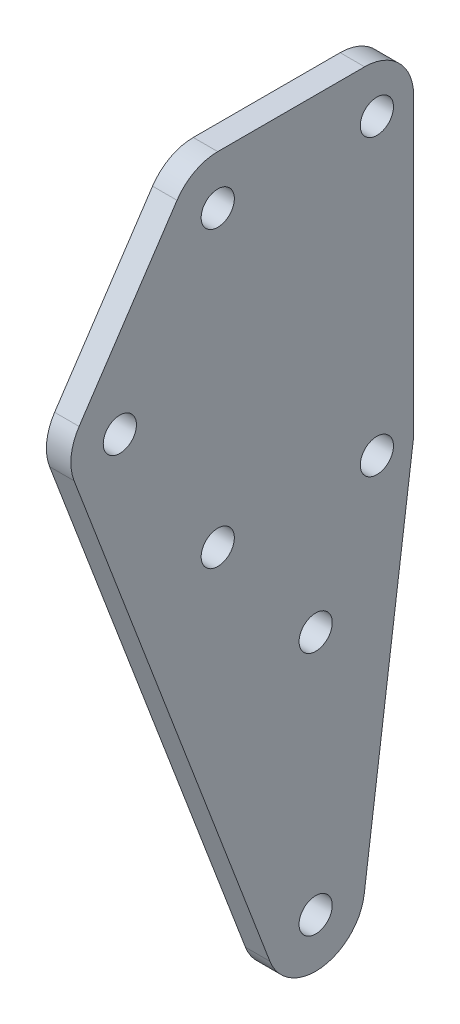
ISO-10303-21;
HEADER;
FILE_DESCRIPTION(('STEP AP214'),'2;1');
FILE_NAME('part.step','',(''),(''),'','','');
FILE_SCHEMA(('AUTOMOTIVE_DESIGN { 1 0 10303 214 1 1 1 1 }'));
ENDSEC;
DATA;
#1=APPLICATION_CONTEXT('core data for automotive mechanical design processes');
#2=APPLICATION_PROTOCOL_DEFINITION('international standard','automotive_design',2000,#1);
#3=PRODUCT_CONTEXT('',#1,'mechanical');
#4=PRODUCT('Part','Part','',(#3));
#5=PRODUCT_RELATED_PRODUCT_CATEGORY('part','',(#4));
#6=PRODUCT_DEFINITION_FORMATION('','',#4);
#7=PRODUCT_DEFINITION_CONTEXT('part definition',#1,'design');
#8=PRODUCT_DEFINITION('design','',#6,#7);
#9=PRODUCT_DEFINITION_SHAPE('','',#8);
#10=(LENGTH_UNIT() NAMED_UNIT(*) SI_UNIT(.MILLI.,.METRE.));
#11=(NAMED_UNIT(*) PLANE_ANGLE_UNIT() SI_UNIT($,.RADIAN.));
#12=(NAMED_UNIT(*) SI_UNIT($,.STERADIAN.) SOLID_ANGLE_UNIT());
#13=UNCERTAINTY_MEASURE_WITH_UNIT(LENGTH_MEASURE(1.E-05),#10,'distance_accuracy_value','');
#14=(GEOMETRIC_REPRESENTATION_CONTEXT(3) GLOBAL_UNCERTAINTY_ASSIGNED_CONTEXT((#13)) GLOBAL_UNIT_ASSIGNED_CONTEXT((#10,
#11,#12)) REPRESENTATION_CONTEXT('',''));
#15=CARTESIAN_POINT('',(0.,0.,0.));
#16=DIRECTION('',(0.,0.,1.));
#17=DIRECTION('',(1.,0.,0.));
#18=AXIS2_PLACEMENT_3D('',#15,#16,#17);
#19=CARTESIAN_POINT('',(1.5875,-50.8,-25.4));
#20=DIRECTION('',(0.,0.,1.));
#21=DIRECTION('',(1.,0.,0.));
#22=AXIS2_PLACEMENT_3D('',#19,#20,#21);
#23=PLANE('',#22);
#24=DIRECTION('',(-1.,0.,0.));
#25=VECTOR('',#24,1.);
#26=CARTESIAN_POINT('',(1.5875,44.4499999999997,-25.4));
#27=LINE('',#26,#25);
#28=CARTESIAN_POINT('',(1.5875,44.4499999999997,-25.4));
#29=VERTEX_POINT('',#28);
#30=CARTESIAN_POINT('',(-1.5875,44.4499999999997,-25.4));
#31=VERTEX_POINT('',#30);
#32=EDGE_CURVE('E57',#29,#31,#27,.T.);
#33=ORIENTED_EDGE('',*,*,#32,.F.);
#34=DIRECTION('',(0.,1.,0.));
#35=VECTOR('',#34,1.);
#36=CARTESIAN_POINT('',(1.5875,-50.8,-25.4));
#37=LINE('',#36,#35);
#38=CARTESIAN_POINT('',(1.5875,6.3499999999998,-25.4));
#39=VERTEX_POINT('',#38);
#40=EDGE_CURVE('E41',#39,#29,#37,.T.);
#41=ORIENTED_EDGE('',*,*,#40,.F.);
#42=DIRECTION('',(-1.,0.,0.));
#43=VECTOR('',#42,1.);
#44=CARTESIAN_POINT('',(1.5875,6.3499999999998,-25.4));
#45=LINE('',#44,#43);
#46=CARTESIAN_POINT('',(-1.5875,6.3499999999998,-25.4));
#47=VERTEX_POINT('',#46);
#48=EDGE_CURVE('E125',#39,#47,#45,.T.);
#49=ORIENTED_EDGE('',*,*,#48,.T.);
#50=DIRECTION('',(0.,1.,0.));
#51=VECTOR('',#50,1.);
#52=CARTESIAN_POINT('',(-1.5875,-50.8,-25.4));
#53=LINE('',#52,#51);
#54=EDGE_CURVE('E124',#47,#31,#53,.T.);
#55=ORIENTED_EDGE('',*,*,#54,.T.);
#56=EDGE_LOOP('',(#33,#41,#49,#55));
#57=FACE_BOUND('',#56,.T.);
#58=ADVANCED_FACE('F33',(#57),#23,.F.);
#59=CARTESIAN_POINT('',(1.5875,50.8,25.4));
#60=DIRECTION('',(0.,-1.,0.));
#61=DIRECTION('',(0.,0.,-1.));
#62=AXIS2_PLACEMENT_3D('',#59,#60,#61);
#63=PLANE('',#62);
#64=DIRECTION('',(0.,0.,1.));
#65=VECTOR('',#64,1.);
#66=CARTESIAN_POINT('',(1.5875,50.8,25.4));
#67=LINE('',#66,#65);
#68=CARTESIAN_POINT('',(1.5875,50.8,-19.0499999999997));
#69=VERTEX_POINT('',#68);
#70=CARTESIAN_POINT('',(1.5875,50.8,0.));
#71=VERTEX_POINT('',#70);
#72=EDGE_CURVE('E11',#69,#71,#67,.T.);
#73=ORIENTED_EDGE('',*,*,#72,.F.);
#74=DIRECTION('',(-1.,0.,0.));
#75=VECTOR('',#74,1.);
#76=CARTESIAN_POINT('',(1.5875,50.8,-19.0499999999997));
#77=LINE('',#76,#75);
#78=CARTESIAN_POINT('',(-1.5875,50.8,-19.0499999999997));
#79=VERTEX_POINT('',#78);
#80=EDGE_CURVE('E112',#69,#79,#77,.T.);
#81=ORIENTED_EDGE('',*,*,#80,.T.);
#82=DIRECTION('',(0.,0.,1.));
#83=VECTOR('',#82,1.);
#84=CARTESIAN_POINT('',(-1.5875,50.8,25.4));
#85=LINE('',#84,#83);
#86=CARTESIAN_POINT('',(-1.5875,50.8,0.));
#87=VERTEX_POINT('',#86);
#88=EDGE_CURVE('E36',#79,#87,#85,.T.);
#89=ORIENTED_EDGE('',*,*,#88,.T.);
#90=DIRECTION('',(-1.,0.,0.));
#91=VECTOR('',#90,1.);
#92=CARTESIAN_POINT('',(1.5875,50.8,0.));
#93=LINE('',#92,#91);
#94=EDGE_CURVE('E194',#71,#87,#93,.T.);
#95=ORIENTED_EDGE('',*,*,#94,.F.);
#96=EDGE_LOOP('',(#73,#81,#89,#95));
#97=FACE_BOUND('',#96,.T.);
#98=ADVANCED_FACE('F246',(#97),#63,.F.);
#99=CARTESIAN_POINT('',(1.5875,0.,0.));
#100=DIRECTION('',(-1.,0.,0.));
#101=DIRECTION('',(0.,0.,1.));
#102=AXIS2_PLACEMENT_3D('',#99,#100,#101);
#103=PLANE('',#102);
#104=CARTESIAN_POINT('',(1.5875,-41.2750000000002,-12.7));
#105=DIRECTION('',(-1.,0.,0.));
#106=DIRECTION('',(0.,0.,1.));
#107=AXIS2_PLACEMENT_3D('',#104,#105,#106);
#108=CIRCLE('',#107,2.15265);
#109=CARTESIAN_POINT('',(1.5875,-41.2750000000002,-10.54735));
#110=VERTEX_POINT('',#109);
#111=EDGE_CURVE('E175',#110,#110,#108,.T.);
#112=ORIENTED_EDGE('',*,*,#111,.T.);
#113=EDGE_LOOP('',(#112));
#114=FACE_BOUND('',#113,.T.);
#115=CARTESIAN_POINT('',(1.5875,-9.52500000000017,-12.7));
#116=DIRECTION('',(-1.,0.,0.));
#117=DIRECTION('',(0.,0.,1.));
#118=AXIS2_PLACEMENT_3D('',#115,#116,#117);
#119=CIRCLE('',#118,2.15265);
#120=CARTESIAN_POINT('',(1.5875,-9.52500000000017,-10.54735));
#121=VERTEX_POINT('',#120);
#122=EDGE_CURVE('E169',#121,#121,#119,.T.);
#123=ORIENTED_EDGE('',*,*,#122,.T.);
#124=EDGE_LOOP('',(#123));
#125=FACE_BOUND('',#124,.T.);
#126=CARTESIAN_POINT('',(1.5875,6.3499999999998,-20.6375));
#127=DIRECTION('',(-1.,0.,0.));
#128=DIRECTION('',(0.,0.,1.));
#129=AXIS2_PLACEMENT_3D('',#126,#127,#128);
#130=CIRCLE('',#129,2.15265);
#131=CARTESIAN_POINT('',(1.5875,6.3499999999998,-18.48485));
#132=VERTEX_POINT('',#131);
#133=EDGE_CURVE('E163',#132,#132,#130,.T.);
#134=ORIENTED_EDGE('',*,*,#133,.T.);
#135=EDGE_LOOP('',(#134));
#136=FACE_BOUND('',#135,.T.);
#137=CARTESIAN_POINT('',(1.5875,6.34999999999968,0.));
#138=DIRECTION('',(-1.,0.,0.));
#139=DIRECTION('',(0.,0.,1.));
#140=AXIS2_PLACEMENT_3D('',#137,#138,#139);
#141=CIRCLE('',#140,2.15265);
#142=CARTESIAN_POINT('',(1.5875,6.34999999999968,2.15265000000005));
#143=VERTEX_POINT('',#142);
#144=EDGE_CURVE('E157',#143,#143,#141,.T.);
#145=ORIENTED_EDGE('',*,*,#144,.T.);
#146=EDGE_LOOP('',(#145));
#147=FACE_BOUND('',#146,.T.);
#148=CARTESIAN_POINT('',(1.5875,25.3999999999997,12.7000000000001));
#149=DIRECTION('',(-1.,0.,0.));
#150=DIRECTION('',(0.,0.,1.));
#151=AXIS2_PLACEMENT_3D('',#148,#149,#150);
#152=CIRCLE('',#151,2.15265);
#153=CARTESIAN_POINT('',(1.5875,25.3999999999997,14.8526500000001));
#154=VERTEX_POINT('',#153);
#155=EDGE_CURVE('E151',#154,#154,#152,.T.);
#156=ORIENTED_EDGE('',*,*,#155,.T.);
#157=EDGE_LOOP('',(#156));
#158=FACE_BOUND('',#157,.T.);
#159=CARTESIAN_POINT('',(1.5875,44.4499999999997,0.));
#160=DIRECTION('',(-1.,0.,0.));
#161=DIRECTION('',(0.,0.,1.));
#162=AXIS2_PLACEMENT_3D('',#159,#160,#161);
#163=CIRCLE('',#162,2.15265);
#164=CARTESIAN_POINT('',(1.5875,44.4499999999997,2.15265000000005));
#165=VERTEX_POINT('',#164);
#166=EDGE_CURVE('E142',#165,#165,#163,.T.);
#167=ORIENTED_EDGE('',*,*,#166,.T.);
#168=EDGE_LOOP('',(#167));
#169=FACE_BOUND('',#168,.T.);
#170=CARTESIAN_POINT('',(1.5875,44.4499999999998,-20.6375));
#171=DIRECTION('',(-1.,0.,0.));
#172=DIRECTION('',(0.,0.,1.));
#173=AXIS2_PLACEMENT_3D('',#170,#171,#172);
#174=CIRCLE('',#173,2.15265);
#175=CARTESIAN_POINT('',(1.5875,44.4499999999998,-18.48485));
#176=VERTEX_POINT('',#175);
#177=EDGE_CURVE('E135',#176,#176,#174,.T.);
#178=ORIENTED_EDGE('',*,*,#177,.T.);
#179=EDGE_LOOP('',(#178));
#180=FACE_BOUND('',#179,.T.);
#181=CARTESIAN_POINT('',(1.5875,44.4499999999997,-19.0499999999997));
#182=DIRECTION('',(-1.,0.,0.));
#183=DIRECTION('',(0.,0.,1.));
#184=AXIS2_PLACEMENT_3D('',#181,#182,#183);
#185=CIRCLE('',#184,6.35000000000031);
#186=EDGE_CURVE('E109',#69,#29,#185,.T.);
#187=ORIENTED_EDGE('',*,*,#186,.F.);
#188=ORIENTED_EDGE('',*,*,#72,.T.);
#189=CARTESIAN_POINT('',(1.5875,44.4499999999997,0.));
#190=DIRECTION('',(-1.,0.,0.));
#191=DIRECTION('',(0.,0.,-1.));
#192=AXIS2_PLACEMENT_3D('',#189,#190,#191);
#193=CIRCLE('',#192,6.35000000000032);
#194=CARTESIAN_POINT('',(1.5875,47.97234624603,5.28351936904567));
#195=VERTEX_POINT('',#194);
#196=EDGE_CURVE('E126',#195,#71,#193,.T.);
#197=ORIENTED_EDGE('',*,*,#196,.F.);
#198=DIRECTION('',(0.,0.832050294337851,-0.554700196225218));
#199=VECTOR('',#198,1.);
#200=CARTESIAN_POINT('',(1.5875,47.97234624603,5.28351936904567));
#201=LINE('',#200,#199);
#202=CARTESIAN_POINT('',(1.5875,28.9223462460298,17.9835193690454));
#203=VERTEX_POINT('',#202);
#204=EDGE_CURVE('E218',#203,#195,#201,.T.);
#205=ORIENTED_EDGE('',*,*,#204,.F.);
#206=CARTESIAN_POINT('',(1.5875,25.3999999999997,12.7000000000001));
#207=DIRECTION('',(-1.,0.,0.));
#208=DIRECTION('',(0.,0.,-1.));
#209=AXIS2_PLACEMENT_3D('',#206,#207,#208);
#210=CIRCLE('',#209,6.35);
#211=CARTESIAN_POINT('',(1.5875,23.1394296697906,18.633997116799));
#212=VERTEX_POINT('',#211);
#213=EDGE_CURVE('E221',#212,#203,#210,.T.);
#214=ORIENTED_EDGE('',*,*,#213,.F.);
#215=DIRECTION('',(0.,0.934487734928968,0.355995327591989));
#216=VECTOR('',#215,1.);
#217=CARTESIAN_POINT('',(1.5875,-43.5355703302093,-6.76600288320103));
#218=LINE('',#217,#216);
#219=CARTESIAN_POINT('',(1.5875,-43.5355703302093,-6.76600288320103));
#220=VERTEX_POINT('',#219);
#221=EDGE_CURVE('E224',#220,#212,#218,.T.);
#222=ORIENTED_EDGE('',*,*,#221,.F.);
#223=CARTESIAN_POINT('',(1.5875,-41.2750000000002,-12.7));
#224=DIRECTION('',(-1.,0.,0.));
#225=DIRECTION('',(0.,0.,1.));
#226=AXIS2_PLACEMENT_3D('',#223,#224,#225);
#227=CIRCLE('',#226,6.35);
#228=CARTESIAN_POINT('',(1.5875,-42.1124231824345,-18.9945390946058));
#229=VERTEX_POINT('',#228);
#230=EDGE_CURVE('E227',#229,#220,#227,.T.);
#231=ORIENTED_EDGE('',*,*,#230,.F.);
#232=DIRECTION('',(0.,-0.991265999150529,0.131877666525089));
#233=VECTOR('',#232,1.);
#234=CARTESIAN_POINT('',(1.5875,5.72193261317406,-25.3584043209544));
#235=LINE('',#234,#233);
#236=CARTESIAN_POINT('',(1.5875,5.72193261317406,-25.3584043209544));
#237=VERTEX_POINT('',#236);
#238=EDGE_CURVE('E230',#237,#229,#235,.T.);
#239=ORIENTED_EDGE('',*,*,#238,.F.);
#240=CARTESIAN_POINT('',(1.5875,6.3499999999998,-20.6375));
#241=DIRECTION('',(-1.,0.,0.));
#242=DIRECTION('',(0.,0.,1.));
#243=AXIS2_PLACEMENT_3D('',#240,#241,#242);
#244=CIRCLE('',#243,4.76250000000001);
#245=EDGE_CURVE('E116',#39,#237,#244,.T.);
#246=ORIENTED_EDGE('',*,*,#245,.F.);
#247=ORIENTED_EDGE('',*,*,#40,.T.);
#248=EDGE_LOOP('',(#187,#188,#197,#205,#214,#222,#231,#239,#246,#247));
#249=FACE_BOUND('',#248,.T.);
#250=ADVANCED_FACE('F129',(#114,#125,#136,#147,#158,#169,#180,#249),#103,.F.);
#251=CARTESIAN_POINT('',(-1.5875,0.,0.));
#252=DIRECTION('',(-1.,0.,0.));
#253=DIRECTION('',(0.,0.,1.));
#254=AXIS2_PLACEMENT_3D('',#251,#252,#253);
#255=PLANE('',#254);
#256=CARTESIAN_POINT('',(-1.5875,-41.2750000000002,-12.7));
#257=DIRECTION('',(-1.,0.,0.));
#258=DIRECTION('',(0.,0.,1.));
#259=AXIS2_PLACEMENT_3D('',#256,#257,#258);
#260=CIRCLE('',#259,2.15264999999999);
#261=CARTESIAN_POINT('',(-1.5875,-41.2750000000002,-10.54735));
#262=VERTEX_POINT('',#261);
#263=EDGE_CURVE('E178',#262,#262,#260,.T.);
#264=ORIENTED_EDGE('',*,*,#263,.F.);
#265=EDGE_LOOP('',(#264));
#266=FACE_BOUND('',#265,.T.);
#267=CARTESIAN_POINT('',(-1.5875,-9.52500000000017,-12.7));
#268=DIRECTION('',(-1.,0.,0.));
#269=DIRECTION('',(0.,0.,1.));
#270=AXIS2_PLACEMENT_3D('',#267,#268,#269);
#271=CIRCLE('',#270,2.15264999999999);
#272=CARTESIAN_POINT('',(-1.5875,-9.52500000000017,-10.54735));
#273=VERTEX_POINT('',#272);
#274=EDGE_CURVE('E172',#273,#273,#271,.T.);
#275=ORIENTED_EDGE('',*,*,#274,.F.);
#276=EDGE_LOOP('',(#275));
#277=FACE_BOUND('',#276,.T.);
#278=CARTESIAN_POINT('',(-1.5875,6.3499999999998,-20.6375));
#279=DIRECTION('',(-1.,0.,0.));
#280=DIRECTION('',(0.,0.,1.));
#281=AXIS2_PLACEMENT_3D('',#278,#279,#280);
#282=CIRCLE('',#281,2.15264999999999);
#283=CARTESIAN_POINT('',(-1.5875,6.3499999999998,-18.48485));
#284=VERTEX_POINT('',#283);
#285=EDGE_CURVE('E166',#284,#284,#282,.T.);
#286=ORIENTED_EDGE('',*,*,#285,.F.);
#287=EDGE_LOOP('',(#286));
#288=FACE_BOUND('',#287,.T.);
#289=CARTESIAN_POINT('',(-1.5875,6.34999999999968,0.));
#290=DIRECTION('',(-1.,0.,0.));
#291=DIRECTION('',(0.,0.,1.));
#292=AXIS2_PLACEMENT_3D('',#289,#290,#291);
#293=CIRCLE('',#292,2.15264999999999);
#294=CARTESIAN_POINT('',(-1.5875,6.34999999999968,2.15265000000004));
#295=VERTEX_POINT('',#294);
#296=EDGE_CURVE('E160',#295,#295,#293,.T.);
#297=ORIENTED_EDGE('',*,*,#296,.F.);
#298=EDGE_LOOP('',(#297));
#299=FACE_BOUND('',#298,.T.);
#300=CARTESIAN_POINT('',(-1.5875,25.3999999999997,12.7000000000001));
#301=DIRECTION('',(-1.,0.,0.));
#302=DIRECTION('',(0.,0.,1.));
#303=AXIS2_PLACEMENT_3D('',#300,#301,#302);
#304=CIRCLE('',#303,2.15264999999999);
#305=CARTESIAN_POINT('',(-1.5875,25.3999999999997,14.8526500000001));
#306=VERTEX_POINT('',#305);
#307=EDGE_CURVE('E154',#306,#306,#304,.T.);
#308=ORIENTED_EDGE('',*,*,#307,.F.);
#309=EDGE_LOOP('',(#308));
#310=FACE_BOUND('',#309,.T.);
#311=CARTESIAN_POINT('',(-1.5875,44.4499999999997,0.));
#312=DIRECTION('',(-1.,0.,0.));
#313=DIRECTION('',(0.,0.,1.));
#314=AXIS2_PLACEMENT_3D('',#311,#312,#313);
#315=CIRCLE('',#314,2.15264999999999);
#316=CARTESIAN_POINT('',(-1.5875,44.4499999999997,2.15265000000005));
#317=VERTEX_POINT('',#316);
#318=EDGE_CURVE('E146',#317,#317,#315,.T.);
#319=ORIENTED_EDGE('',*,*,#318,.F.);
#320=EDGE_LOOP('',(#319));
#321=FACE_BOUND('',#320,.T.);
#322=CARTESIAN_POINT('',(-1.5875,44.4499999999998,-20.6375));
#323=DIRECTION('',(-1.,0.,0.));
#324=DIRECTION('',(0.,0.,1.));
#325=AXIS2_PLACEMENT_3D('',#322,#323,#324);
#326=CIRCLE('',#325,2.15264999999999);
#327=CARTESIAN_POINT('',(-1.5875,44.4499999999998,-18.48485));
#328=VERTEX_POINT('',#327);
#329=EDGE_CURVE('E138',#328,#328,#326,.T.);
#330=ORIENTED_EDGE('',*,*,#329,.F.);
#331=EDGE_LOOP('',(#330));
#332=FACE_BOUND('',#331,.T.);
#333=ORIENTED_EDGE('',*,*,#88,.F.);
#334=CARTESIAN_POINT('',(-1.5875,44.4499999999997,-19.0499999999997));
#335=DIRECTION('',(-1.,0.,0.));
#336=DIRECTION('',(0.,0.,1.));
#337=AXIS2_PLACEMENT_3D('',#334,#335,#336);
#338=CIRCLE('',#337,6.35000000000031);
#339=EDGE_CURVE('E215',#79,#31,#338,.T.);
#340=ORIENTED_EDGE('',*,*,#339,.T.);
#341=ORIENTED_EDGE('',*,*,#54,.F.);
#342=CARTESIAN_POINT('',(-1.5875,6.3499999999998,-20.6375));
#343=DIRECTION('',(-1.,0.,0.));
#344=DIRECTION('',(0.,0.,1.));
#345=AXIS2_PLACEMENT_3D('',#342,#343,#344);
#346=CIRCLE('',#345,4.76250000000001);
#347=CARTESIAN_POINT('',(-1.5875,5.72193261317406,-25.3584043209544));
#348=VERTEX_POINT('',#347);
#349=EDGE_CURVE('E212',#47,#348,#346,.T.);
#350=ORIENTED_EDGE('',*,*,#349,.T.);
#351=DIRECTION('',(0.,-0.991265999150529,0.131877666525089));
#352=VECTOR('',#351,1.);
#353=CARTESIAN_POINT('',(-1.5875,5.72193261317406,-25.3584043209544));
#354=LINE('',#353,#352);
#355=CARTESIAN_POINT('',(-1.5875,-42.1124231824345,-18.9945390946058));
#356=VERTEX_POINT('',#355);
#357=EDGE_CURVE('E49',#348,#356,#354,.T.);
#358=ORIENTED_EDGE('',*,*,#357,.T.);
#359=CARTESIAN_POINT('',(-1.5875,-41.2750000000002,-12.7));
#360=DIRECTION('',(-1.,0.,0.));
#361=DIRECTION('',(0.,0.,1.));
#362=AXIS2_PLACEMENT_3D('',#359,#360,#361);
#363=CIRCLE('',#362,6.35);
#364=CARTESIAN_POINT('',(-1.5875,-43.5355703302093,-6.76600288320103));
#365=VERTEX_POINT('',#364);
#366=EDGE_CURVE('E208',#356,#365,#363,.T.);
#367=ORIENTED_EDGE('',*,*,#366,.T.);
#368=DIRECTION('',(0.,0.934487734928968,0.355995327591989));
#369=VECTOR('',#368,1.);
#370=CARTESIAN_POINT('',(-1.5875,-43.5355703302093,-6.76600288320103));
#371=LINE('',#370,#369);
#372=CARTESIAN_POINT('',(-1.5875,23.1394296697906,18.633997116799));
#373=VERTEX_POINT('',#372);
#374=EDGE_CURVE('E205',#365,#373,#371,.T.);
#375=ORIENTED_EDGE('',*,*,#374,.T.);
#376=CARTESIAN_POINT('',(-1.5875,25.3999999999997,12.7000000000001));
#377=DIRECTION('',(-1.,0.,0.));
#378=DIRECTION('',(0.,0.,-1.));
#379=AXIS2_PLACEMENT_3D('',#376,#377,#378);
#380=CIRCLE('',#379,6.35);
#381=CARTESIAN_POINT('',(-1.5875,28.9223462460298,17.9835193690454));
#382=VERTEX_POINT('',#381);
#383=EDGE_CURVE('E202',#373,#382,#380,.T.);
#384=ORIENTED_EDGE('',*,*,#383,.T.);
#385=DIRECTION('',(0.,0.832050294337851,-0.554700196225218));
#386=VECTOR('',#385,1.);
#387=CARTESIAN_POINT('',(-1.5875,47.97234624603,5.28351936904567));
#388=LINE('',#387,#386);
#389=CARTESIAN_POINT('',(-1.5875,47.97234624603,5.28351936904567));
#390=VERTEX_POINT('',#389);
#391=EDGE_CURVE('E199',#382,#390,#388,.T.);
#392=ORIENTED_EDGE('',*,*,#391,.T.);
#393=CARTESIAN_POINT('',(-1.5875,44.4499999999997,0.));
#394=DIRECTION('',(-1.,0.,0.));
#395=DIRECTION('',(0.,0.,-1.));
#396=AXIS2_PLACEMENT_3D('',#393,#394,#395);
#397=CIRCLE('',#396,6.35000000000032);
#398=EDGE_CURVE('E117',#390,#87,#397,.T.);
#399=ORIENTED_EDGE('',*,*,#398,.T.);
#400=EDGE_LOOP('',(#333,#340,#341,#350,#358,#367,#375,#384,#392,#399));
#401=FACE_BOUND('',#400,.T.);
#402=ADVANCED_FACE('F244',(#266,#277,#288,#299,#310,#321,#332,#401),#255,.T.);
#403=CARTESIAN_POINT('',(-1.5875,44.4499999999998,-20.6375));
#404=DIRECTION('',(-1.,0.,0.));
#405=DIRECTION('',(0.,0.,1.));
#406=AXIS2_PLACEMENT_3D('',#403,#404,#405);
#407=CYLINDRICAL_SURFACE('',#406,2.15265);
#408=ORIENTED_EDGE('',*,*,#177,.F.);
#409=EDGE_LOOP('',(#408));
#410=FACE_BOUND('',#409,.T.);
#411=ORIENTED_EDGE('',*,*,#329,.T.);
#412=EDGE_LOOP('',(#411));
#413=FACE_BOUND('',#412,.T.);
#414=ADVANCED_FACE('F282',(#410,#413),#407,.F.);
#415=CARTESIAN_POINT('',(-1.5875,44.4499999999997,0.));
#416=DIRECTION('',(-1.,0.,0.));
#417=DIRECTION('',(0.,0.,1.));
#418=AXIS2_PLACEMENT_3D('',#415,#416,#417);
#419=CYLINDRICAL_SURFACE('',#418,2.15265);
#420=ORIENTED_EDGE('',*,*,#166,.F.);
#421=EDGE_LOOP('',(#420));
#422=FACE_BOUND('',#421,.T.);
#423=ORIENTED_EDGE('',*,*,#318,.T.);
#424=EDGE_LOOP('',(#423));
#425=FACE_BOUND('',#424,.T.);
#426=ADVANCED_FACE('F287',(#422,#425),#419,.F.);
#427=CARTESIAN_POINT('',(-1.5875,25.3999999999997,12.7000000000001));
#428=DIRECTION('',(-1.,0.,0.));
#429=DIRECTION('',(0.,0.,1.));
#430=AXIS2_PLACEMENT_3D('',#427,#428,#429);
#431=CYLINDRICAL_SURFACE('',#430,2.15264999999999);
#432=ORIENTED_EDGE('',*,*,#155,.F.);
#433=EDGE_LOOP('',(#432));
#434=FACE_BOUND('',#433,.T.);
#435=ORIENTED_EDGE('',*,*,#307,.T.);
#436=EDGE_LOOP('',(#435));
#437=FACE_BOUND('',#436,.T.);
#438=ADVANCED_FACE('F291',(#434,#437),#431,.F.);
#439=CARTESIAN_POINT('',(-1.5875,6.34999999999968,0.));
#440=DIRECTION('',(-1.,0.,0.));
#441=DIRECTION('',(0.,0.,1.));
#442=AXIS2_PLACEMENT_3D('',#439,#440,#441);
#443=CYLINDRICAL_SURFACE('',#442,2.15264999999999);
#444=ORIENTED_EDGE('',*,*,#144,.F.);
#445=EDGE_LOOP('',(#444));
#446=FACE_BOUND('',#445,.T.);
#447=ORIENTED_EDGE('',*,*,#296,.T.);
#448=EDGE_LOOP('',(#447));
#449=FACE_BOUND('',#448,.T.);
#450=ADVANCED_FACE('F295',(#446,#449),#443,.F.);
#451=CARTESIAN_POINT('',(-1.5875,6.3499999999998,-20.6375));
#452=DIRECTION('',(-1.,0.,0.));
#453=DIRECTION('',(0.,0.,1.));
#454=AXIS2_PLACEMENT_3D('',#451,#452,#453);
#455=CYLINDRICAL_SURFACE('',#454,2.15264999999999);
#456=ORIENTED_EDGE('',*,*,#133,.F.);
#457=EDGE_LOOP('',(#456));
#458=FACE_BOUND('',#457,.T.);
#459=ORIENTED_EDGE('',*,*,#285,.T.);
#460=EDGE_LOOP('',(#459));
#461=FACE_BOUND('',#460,.T.);
#462=ADVANCED_FACE('F299',(#458,#461),#455,.F.);
#463=CARTESIAN_POINT('',(-1.5875,-9.52500000000017,-12.7));
#464=DIRECTION('',(-1.,0.,0.));
#465=DIRECTION('',(0.,0.,1.));
#466=AXIS2_PLACEMENT_3D('',#463,#464,#465);
#467=CYLINDRICAL_SURFACE('',#466,2.15264999999999);
#468=ORIENTED_EDGE('',*,*,#122,.F.);
#469=EDGE_LOOP('',(#468));
#470=FACE_BOUND('',#469,.T.);
#471=ORIENTED_EDGE('',*,*,#274,.T.);
#472=EDGE_LOOP('',(#471));
#473=FACE_BOUND('',#472,.T.);
#474=ADVANCED_FACE('F303',(#470,#473),#467,.F.);
#475=CARTESIAN_POINT('',(-1.5875,-41.2750000000002,-12.7));
#476=DIRECTION('',(-1.,0.,0.));
#477=DIRECTION('',(0.,0.,1.));
#478=AXIS2_PLACEMENT_3D('',#475,#476,#477);
#479=CYLINDRICAL_SURFACE('',#478,2.15265);
#480=ORIENTED_EDGE('',*,*,#111,.F.);
#481=EDGE_LOOP('',(#480));
#482=FACE_BOUND('',#481,.T.);
#483=ORIENTED_EDGE('',*,*,#263,.T.);
#484=EDGE_LOOP('',(#483));
#485=FACE_BOUND('',#484,.T.);
#486=ADVANCED_FACE('F307',(#482,#485),#479,.F.);
#487=CARTESIAN_POINT('',(1.5875,6.3499999999998,-20.6375));
#488=DIRECTION('',(-1.,0.,0.));
#489=DIRECTION('',(0.,0.,1.));
#490=AXIS2_PLACEMENT_3D('',#487,#488,#489);
#491=CYLINDRICAL_SURFACE('',#490,4.76250000000001);
#492=ORIENTED_EDGE('',*,*,#349,.F.);
#493=ORIENTED_EDGE('',*,*,#48,.F.);
#494=ORIENTED_EDGE('',*,*,#245,.T.);
#495=DIRECTION('',(-1.,0.,0.));
#496=VECTOR('',#495,1.);
#497=CARTESIAN_POINT('',(1.5875,5.72193261317406,-25.3584043209544));
#498=LINE('',#497,#496);
#499=EDGE_CURVE('E182',#237,#348,#498,.T.);
#500=ORIENTED_EDGE('',*,*,#499,.T.);
#501=EDGE_LOOP('',(#492,#493,#494,#500));
#502=FACE_BOUND('',#501,.T.);
#503=ADVANCED_FACE('F234',(#502),#491,.T.);
#504=CARTESIAN_POINT('',(1.5875,5.72193261317406,-25.3584043209544));
#505=DIRECTION('',(0.,-0.131877666525089,-0.991265999150529));
#506=DIRECTION('',(0.,0.99126599915053,-0.131877666525089));
#507=AXIS2_PLACEMENT_3D('',#504,#505,#506);
#508=PLANE('',#507);
#509=ORIENTED_EDGE('',*,*,#357,.F.);
#510=ORIENTED_EDGE('',*,*,#499,.F.);
#511=ORIENTED_EDGE('',*,*,#238,.T.);
#512=DIRECTION('',(-1.,0.,0.));
#513=VECTOR('',#512,1.);
#514=CARTESIAN_POINT('',(1.5875,-42.1124231824345,-18.9945390946058));
#515=LINE('',#514,#513);
#516=EDGE_CURVE('E184',#229,#356,#515,.T.);
#517=ORIENTED_EDGE('',*,*,#516,.T.);
#518=EDGE_LOOP('',(#509,#510,#511,#517));
#519=FACE_BOUND('',#518,.T.);
#520=ADVANCED_FACE('F237',(#519),#508,.T.);
#521=CARTESIAN_POINT('',(1.5875,-41.2750000000002,-12.7));
#522=DIRECTION('',(-1.,0.,0.));
#523=DIRECTION('',(0.,0.,1.));
#524=AXIS2_PLACEMENT_3D('',#521,#522,#523);
#525=CYLINDRICAL_SURFACE('',#524,6.35);
#526=ORIENTED_EDGE('',*,*,#366,.F.);
#527=ORIENTED_EDGE('',*,*,#516,.F.);
#528=ORIENTED_EDGE('',*,*,#230,.T.);
#529=DIRECTION('',(-1.,0.,0.));
#530=VECTOR('',#529,1.);
#531=CARTESIAN_POINT('',(1.5875,-43.5355703302093,-6.76600288320103));
#532=LINE('',#531,#530);
#533=EDGE_CURVE('E186',#220,#365,#532,.T.);
#534=ORIENTED_EDGE('',*,*,#533,.T.);
#535=EDGE_LOOP('',(#526,#527,#528,#534));
#536=FACE_BOUND('',#535,.T.);
#537=ADVANCED_FACE('F240',(#536),#525,.T.);
#538=CARTESIAN_POINT('',(1.5875,-43.5355703302093,-6.76600288320103));
#539=DIRECTION('',(0.,-0.355995327591989,0.934487734928968));
#540=DIRECTION('',(0.,-0.934487734928968,-0.355995327591989));
#541=AXIS2_PLACEMENT_3D('',#538,#539,#540);
#542=PLANE('',#541);
#543=ORIENTED_EDGE('',*,*,#374,.F.);
#544=ORIENTED_EDGE('',*,*,#533,.F.);
#545=ORIENTED_EDGE('',*,*,#221,.T.);
#546=DIRECTION('',(-1.,0.,0.));
#547=VECTOR('',#546,1.);
#548=CARTESIAN_POINT('',(1.5875,23.1394296697906,18.633997116799));
#549=LINE('',#548,#547);
#550=EDGE_CURVE('E188',#212,#373,#549,.T.);
#551=ORIENTED_EDGE('',*,*,#550,.T.);
#552=EDGE_LOOP('',(#543,#544,#545,#551));
#553=FACE_BOUND('',#552,.T.);
#554=ADVANCED_FACE('F261',(#553),#542,.T.);
#555=CARTESIAN_POINT('',(1.5875,25.3999999999997,12.7000000000001));
#556=DIRECTION('',(-1.,0.,0.));
#557=DIRECTION('',(0.,0.,1.));
#558=AXIS2_PLACEMENT_3D('',#555,#556,#557);
#559=CYLINDRICAL_SURFACE('',#558,6.35);
#560=ORIENTED_EDGE('',*,*,#383,.F.);
#561=ORIENTED_EDGE('',*,*,#550,.F.);
#562=ORIENTED_EDGE('',*,*,#213,.T.);
#563=DIRECTION('',(-1.,0.,0.));
#564=VECTOR('',#563,1.);
#565=CARTESIAN_POINT('',(1.5875,28.9223462460298,17.9835193690454));
#566=LINE('',#565,#564);
#567=EDGE_CURVE('E190',#203,#382,#566,.T.);
#568=ORIENTED_EDGE('',*,*,#567,.T.);
#569=EDGE_LOOP('',(#560,#561,#562,#568));
#570=FACE_BOUND('',#569,.T.);
#571=ADVANCED_FACE('F259',(#570),#559,.T.);
#572=CARTESIAN_POINT('',(1.5875,47.97234624603,5.28351936904567));
#573=DIRECTION('',(0.,0.554700196225218,0.832050294337851));
#574=DIRECTION('',(0.,-0.832050294337851,0.554700196225218));
#575=AXIS2_PLACEMENT_3D('',#572,#573,#574);
#576=PLANE('',#575);
#577=ORIENTED_EDGE('',*,*,#391,.F.);
#578=ORIENTED_EDGE('',*,*,#567,.F.);
#579=ORIENTED_EDGE('',*,*,#204,.T.);
#580=DIRECTION('',(-1.,0.,0.));
#581=VECTOR('',#580,1.);
#582=CARTESIAN_POINT('',(1.5875,47.97234624603,5.28351936904567));
#583=LINE('',#582,#581);
#584=EDGE_CURVE('E192',#195,#390,#583,.T.);
#585=ORIENTED_EDGE('',*,*,#584,.T.);
#586=EDGE_LOOP('',(#577,#578,#579,#585));
#587=FACE_BOUND('',#586,.T.);
#588=ADVANCED_FACE('F256',(#587),#576,.T.);
#589=CARTESIAN_POINT('',(1.5875,44.4499999999997,0.));
#590=DIRECTION('',(-1.,0.,0.));
#591=DIRECTION('',(0.,0.,1.));
#592=AXIS2_PLACEMENT_3D('',#589,#590,#591);
#593=CYLINDRICAL_SURFACE('',#592,6.35000000000032);
#594=ORIENTED_EDGE('',*,*,#398,.F.);
#595=ORIENTED_EDGE('',*,*,#584,.F.);
#596=ORIENTED_EDGE('',*,*,#196,.T.);
#597=ORIENTED_EDGE('',*,*,#94,.T.);
#598=EDGE_LOOP('',(#594,#595,#596,#597));
#599=FACE_BOUND('',#598,.T.);
#600=ADVANCED_FACE('F253',(#599),#593,.T.);
#601=CARTESIAN_POINT('',(1.5875,44.4499999999997,-19.0499999999997));
#602=DIRECTION('',(-1.,0.,0.));
#603=DIRECTION('',(0.,0.,1.));
#604=AXIS2_PLACEMENT_3D('',#601,#602,#603);
#605=CYLINDRICAL_SURFACE('',#604,6.35000000000031);
#606=ORIENTED_EDGE('',*,*,#339,.F.);
#607=ORIENTED_EDGE('',*,*,#80,.F.);
#608=ORIENTED_EDGE('',*,*,#186,.T.);
#609=ORIENTED_EDGE('',*,*,#32,.T.);
#610=EDGE_LOOP('',(#606,#607,#608,#609));
#611=FACE_BOUND('',#610,.T.);
#612=ADVANCED_FACE('F110',(#611),#605,.T.);
#613=CLOSED_SHELL('',(#58,#98,#250,#402,#414,#426,#438,#450,#462,#474,#486,#503,#520,#537,#554,
#571,#588,#600,#612));
#614=MANIFOLD_SOLID_BREP('B2',#613);
#615=ADVANCED_BREP_SHAPE_REPRESENTATION('',(#18,#614),#14);
#616=SHAPE_DEFINITION_REPRESENTATION(#9,#615);
ENDSEC;
END-ISO-10303-21;
